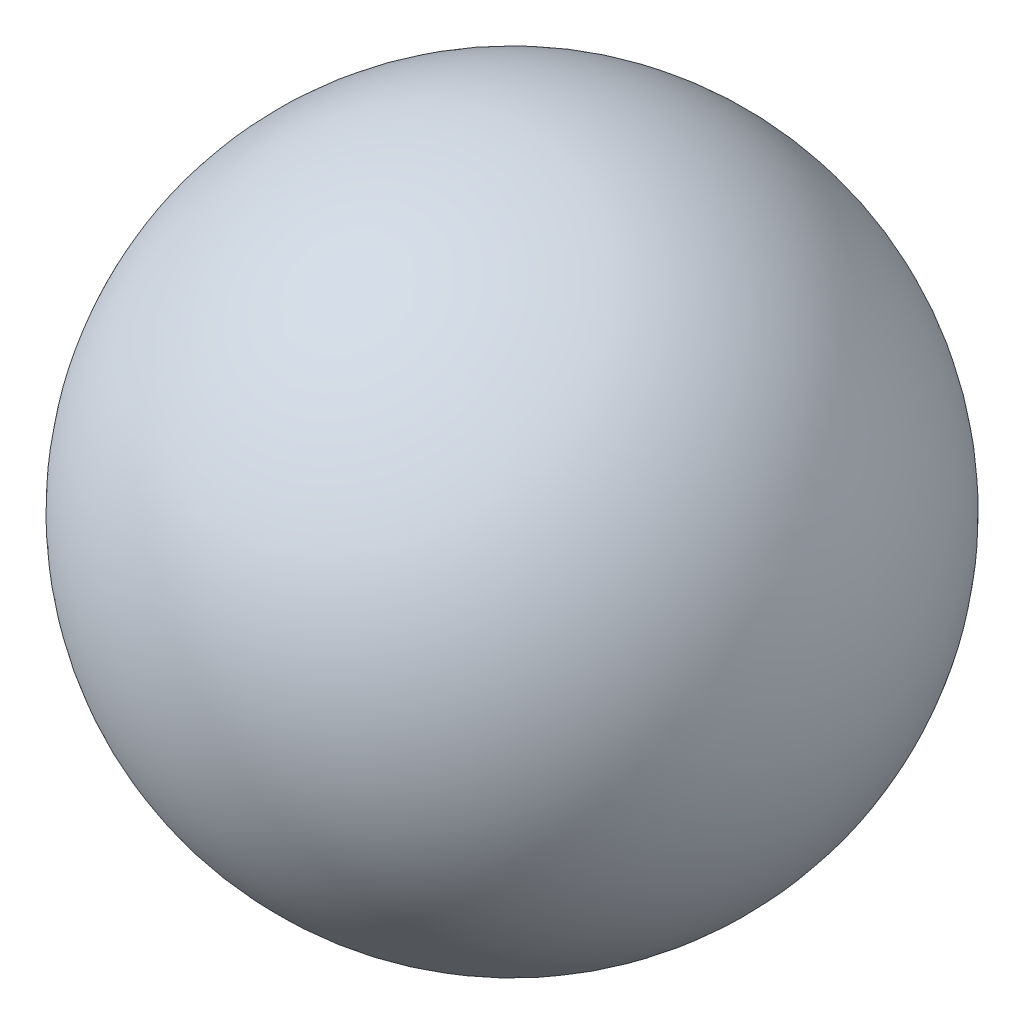
ISO-10303-21;
HEADER;
FILE_DESCRIPTION(('STEP AP214'),'2;1');
FILE_NAME('part.step','',(''),(''),'','','');
FILE_SCHEMA(('AUTOMOTIVE_DESIGN { 1 0 10303 214 1 1 1 1 }'));
ENDSEC;
DATA;
#1=APPLICATION_CONTEXT('core data for automotive mechanical design processes');
#2=APPLICATION_PROTOCOL_DEFINITION('international standard','automotive_design',2000,#1);
#3=PRODUCT_CONTEXT('',#1,'mechanical');
#4=PRODUCT('Part','Part','',(#3));
#5=PRODUCT_RELATED_PRODUCT_CATEGORY('part','',(#4));
#6=PRODUCT_DEFINITION_FORMATION('','',#4);
#7=PRODUCT_DEFINITION_CONTEXT('part definition',#1,'design');
#8=PRODUCT_DEFINITION('design','',#6,#7);
#9=PRODUCT_DEFINITION_SHAPE('','',#8);
#10=(LENGTH_UNIT() NAMED_UNIT(*) SI_UNIT(.MILLI.,.METRE.));
#11=(NAMED_UNIT(*) PLANE_ANGLE_UNIT() SI_UNIT($,.RADIAN.));
#12=(NAMED_UNIT(*) SI_UNIT($,.STERADIAN.) SOLID_ANGLE_UNIT());
#13=UNCERTAINTY_MEASURE_WITH_UNIT(LENGTH_MEASURE(1.E-05),#10,'distance_accuracy_value','');
#14=(GEOMETRIC_REPRESENTATION_CONTEXT(3) GLOBAL_UNCERTAINTY_ASSIGNED_CONTEXT((#13)) GLOBAL_UNIT_ASSIGNED_CONTEXT((#10,
#11,#12)) REPRESENTATION_CONTEXT('',''));
#15=CARTESIAN_POINT('',(0.,0.,0.));
#16=DIRECTION('',(0.,0.,1.));
#17=DIRECTION('',(1.,0.,0.));
#18=AXIS2_PLACEMENT_3D('',#15,#16,#17);
#19=CARTESIAN_POINT('',(3.96875,0.,0.));
#20=DIRECTION('',(1.,0.,0.));
#21=DIRECTION('',(0.,-1.,0.));
#22=AXIS2_PLACEMENT_3D('',#19,#20,#21);
#23=SPHERICAL_SURFACE('',#22,0.758760243513405);
#24=CARTESIAN_POINT('',(4.7275102435134,0.,0.));
#25=VERTEX_POINT('',#24);
#26=VERTEX_LOOP('',#25);
#27=FACE_BOUND('',#26,.T.);
#28=ADVANCED_FACE('F34',(#27),#23,.T.);
#29=CLOSED_SHELL('',(#28));
#30=MANIFOLD_SOLID_BREP('B2',#29);
#31=ADVANCED_BREP_SHAPE_REPRESENTATION('',(#18,#30),#14);
#32=SHAPE_DEFINITION_REPRESENTATION(#9,#31);
ENDSEC;
END-ISO-10303-21;
